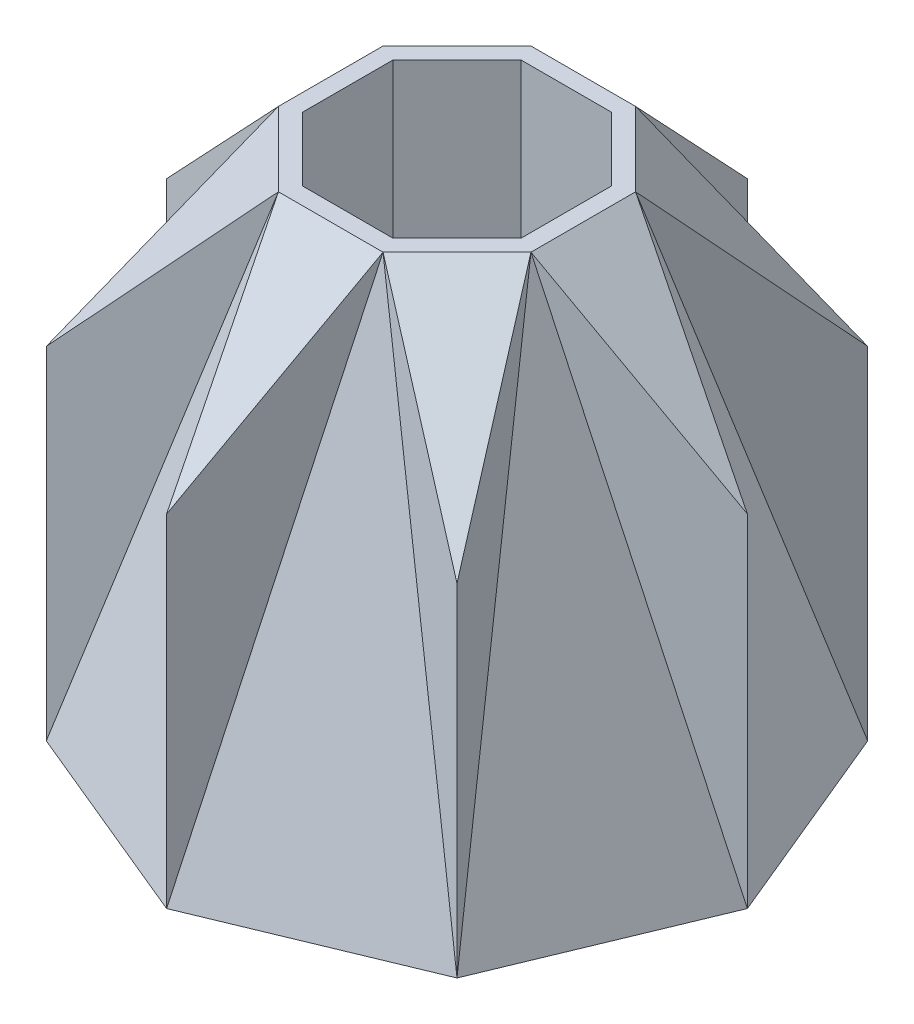
ISO-10303-21;
HEADER;
FILE_DESCRIPTION(('STEP AP214'),'2;1');
FILE_NAME('part.step','',(''),(''),'','','');
FILE_SCHEMA(('AUTOMOTIVE_DESIGN { 1 0 10303 214 1 1 1 1 }'));
ENDSEC;
DATA;
#1=APPLICATION_CONTEXT('core data for automotive mechanical design processes');
#2=APPLICATION_PROTOCOL_DEFINITION('international standard','automotive_design',2000,#1);
#3=PRODUCT_CONTEXT('',#1,'mechanical');
#4=PRODUCT('Part','Part','',(#3));
#5=PRODUCT_RELATED_PRODUCT_CATEGORY('part','',(#4));
#6=PRODUCT_DEFINITION_FORMATION('','',#4);
#7=PRODUCT_DEFINITION_CONTEXT('part definition',#1,'design');
#8=PRODUCT_DEFINITION('design','',#6,#7);
#9=PRODUCT_DEFINITION_SHAPE('','',#8);
#10=(LENGTH_UNIT() NAMED_UNIT(*) SI_UNIT(.MILLI.,.METRE.));
#11=(NAMED_UNIT(*) PLANE_ANGLE_UNIT() SI_UNIT($,.RADIAN.));
#12=(NAMED_UNIT(*) SI_UNIT($,.STERADIAN.) SOLID_ANGLE_UNIT());
#13=UNCERTAINTY_MEASURE_WITH_UNIT(LENGTH_MEASURE(1.E-05),#10,'distance_accuracy_value','');
#14=(GEOMETRIC_REPRESENTATION_CONTEXT(3) GLOBAL_UNCERTAINTY_ASSIGNED_CONTEXT((#13)) GLOBAL_UNIT_ASSIGNED_CONTEXT((#10,
#11,#12)) REPRESENTATION_CONTEXT('',''));
#15=CARTESIAN_POINT('',(0.,0.,0.));
#16=DIRECTION('',(0.,0.,1.));
#17=DIRECTION('',(1.,0.,0.));
#18=AXIS2_PLACEMENT_3D('',#15,#16,#17);
#19=CARTESIAN_POINT('',(15.3073372946032,150.,-36.9551813004516));
#20=DIRECTION('',(-0.952809107235925,0.,0.303570099265852));
#21=DIRECTION('',(0.303570099265852,0.,0.952809107235925));
#22=AXIS2_PLACEMENT_3D('',#19,#20,#21);
#23=PLANE('',#22);
#24=DIRECTION('',(-0.215561683289295,-0.704112280080444,-0.676578936811813));
#25=VECTOR('',#24,1.);
#26=CARTESIAN_POINT('',(3.94972780755112,112.901420186727,-72.6030721232406));
#27=LINE('',#26,#25);
#28=CARTESIAN_POINT('',(15.3073372946032,150.,-36.9551813004516));
#29=VERTEX_POINT('',#28);
#30=CARTESIAN_POINT('',(-1.85204174983817E-12,100.,-85.0000000000001));
#31=VERTEX_POINT('',#30);
#32=EDGE_CURVE('E57',#29,#31,#27,.T.);
#33=ORIENTED_EDGE('',*,*,#32,.F.);
#34=DIRECTION('',(0.0967296858409555,0.947875688429289,0.303603437335304));
#35=VECTOR('',#34,1.);
#36=CARTESIAN_POINT('',(2.49623453466057,24.461156959765,-77.1651209912468));
#37=LINE('',#36,#35);
#38=CARTESIAN_POINT('',(-1.85204174983817E-12,0.,-85.0000000000001));
#39=VERTEX_POINT('',#38);
#40=EDGE_CURVE('E339',#39,#29,#37,.T.);
#41=ORIENTED_EDGE('',*,*,#40,.F.);
#42=DIRECTION('',(0.,-1.,0.));
#43=VECTOR('',#42,1.);
#44=CARTESIAN_POINT('',(-1.85204174983817E-12,150.,-85.0000000000001));
#45=LINE('',#44,#43);
#46=EDGE_CURVE('E336',#31,#39,#45,.T.);
#47=ORIENTED_EDGE('',*,*,#46,.F.);
#48=EDGE_LOOP('',(#33,#41,#47));
#49=FACE_BOUND('',#48,.T.);
#50=ADVANCED_FACE('F41',(#49),#23,.F.);
#51=CARTESIAN_POINT('',(-1.85204174983817E-12,150.,-85.0000000000001));
#52=DIRECTION('',(0.952809107235942,0.,0.303570099265799));
#53=DIRECTION('',(0.303570099265799,0.,-0.952809107235942));
#54=AXIS2_PLACEMENT_3D('',#51,#52,#53);
#55=PLANE('',#54);
#56=DIRECTION('',(0.215561683289256,-0.704112280080448,-0.676578936811822));
#57=VECTOR('',#56,1.);
#58=CARTESIAN_POINT('',(-3.94972780755358,112.901420186725,-72.6030721232422));
#59=LINE('',#58,#57);
#60=CARTESIAN_POINT('',(-15.3073372946036,150.,-36.9551813004515));
#61=VERTEX_POINT('',#60);
#62=EDGE_CURVE('E282',#61,#31,#59,.T.);
#63=ORIENTED_EDGE('',*,*,#62,.T.);
#64=ORIENTED_EDGE('',*,*,#46,.T.);
#65=DIRECTION('',(0.096729685840935,-0.947875688429293,-0.303603437335299));
#66=VECTOR('',#65,1.);
#67=CARTESIAN_POINT('',(-2.49623453466407,24.4611569597638,-77.1651209912459));
#68=LINE('',#67,#66);
#69=EDGE_CURVE('E11',#61,#39,#68,.T.);
#70=ORIENTED_EDGE('',*,*,#69,.F.);
#71=EDGE_LOOP('',(#63,#64,#70));
#72=FACE_BOUND('',#71,.T.);
#73=ADVANCED_FACE('F499',(#72),#55,.F.);
#74=CARTESIAN_POINT('',(36.9551813004515,150.,15.3073372946036));
#75=DIRECTION('',(-0.303570099265842,0.,-0.952809107235928));
#76=DIRECTION('',(-0.952809107235928,0.,0.303570099265842));
#77=AXIS2_PLACEMENT_3D('',#74,#75,#76);
#78=PLANE('',#77);
#79=DIRECTION('',(0.676578936811816,-0.704112280080444,-0.215561683289288));
#80=VECTOR('',#79,1.);
#81=CARTESIAN_POINT('',(72.6030721232407,112.901420186726,3.94972780755187));
#82=LINE('',#81,#80);
#83=CARTESIAN_POINT('',(36.9551813004515,150.,15.3073372946036));
#84=VERTEX_POINT('',#83);
#85=CARTESIAN_POINT('',(85.0000000000001,100.,-9.61714008433168E-13));
#86=VERTEX_POINT('',#85);
#87=EDGE_CURVE('E65',#84,#86,#82,.T.);
#88=ORIENTED_EDGE('',*,*,#87,.F.);
#89=DIRECTION('',(-0.303603437335302,0.94787568842929,0.0967296858409512));
#90=VECTOR('',#89,1.);
#91=CARTESIAN_POINT('',(77.1651209912464,24.4611569597646,2.49623453466149));
#92=LINE('',#91,#90);
#93=CARTESIAN_POINT('',(85.0000000000001,0.,-9.61714008433168E-13));
#94=VERTEX_POINT('',#93);
#95=EDGE_CURVE('E353',#94,#84,#92,.T.);
#96=ORIENTED_EDGE('',*,*,#95,.F.);
#97=DIRECTION('',(0.,-1.,0.));
#98=VECTOR('',#97,1.);
#99=CARTESIAN_POINT('',(85.0000000000001,150.,-9.61714008433168E-13));
#100=LINE('',#99,#98);
#101=EDGE_CURVE('E350',#86,#94,#100,.T.);
#102=ORIENTED_EDGE('',*,*,#101,.F.);
#103=EDGE_LOOP('',(#88,#96,#102));
#104=FACE_BOUND('',#103,.T.);
#105=ADVANCED_FACE('F529',(#104),#78,.F.);
#106=CARTESIAN_POINT('',(85.0000000000001,150.,-9.61714008433168E-13));
#107=DIRECTION('',(-0.303570099265809,0.,0.952809107235939));
#108=DIRECTION('',(0.952809107235939,0.,0.303570099265809));
#109=AXIS2_PLACEMENT_3D('',#106,#107,#108);
#110=PLANE('',#109);
#111=DIRECTION('',(0.676578936811819,-0.704112280080448,0.215561683289264));
#112=VECTOR('',#111,1.);
#113=CARTESIAN_POINT('',(72.6030721232423,112.901420186725,-3.94972780755279));
#114=LINE('',#113,#112);
#115=CARTESIAN_POINT('',(36.9551813004514,150.,-15.3073372946042));
#116=VERTEX_POINT('',#115);
#117=EDGE_CURVE('E287',#116,#86,#114,.T.);
#118=ORIENTED_EDGE('',*,*,#117,.T.);
#119=ORIENTED_EDGE('',*,*,#101,.T.);
#120=DIRECTION('',(0.3036034373353,-0.947875688429292,0.0967296858409387));
#121=VECTOR('',#120,1.);
#122=CARTESIAN_POINT('',(77.1651209912461,24.4611569597641,-2.49623453466321));
#123=LINE('',#122,#121);
#124=EDGE_CURVE('E472',#116,#94,#123,.T.);
#125=ORIENTED_EDGE('',*,*,#124,.F.);
#126=EDGE_LOOP('',(#118,#119,#125));
#127=FACE_BOUND('',#126,.T.);
#128=ADVANCED_FACE('F811',(#127),#110,.F.);
#129=CARTESIAN_POINT('',(-15.3073372946034,150.,36.9551813004515));
#130=DIRECTION('',(0.952809107235927,0.,-0.303570099265845));
#131=DIRECTION('',(-0.303570099265845,0.,-0.952809107235927));
#132=AXIS2_PLACEMENT_3D('',#129,#130,#131);
#133=PLANE('',#132);
#134=DIRECTION('',(0.215561683289291,-0.704112280080444,0.676578936811815));
#135=VECTOR('',#134,1.);
#136=CARTESIAN_POINT('',(-3.94972780755164,112.901420186726,72.6030721232407));
#137=LINE('',#136,#135);
#138=CARTESIAN_POINT('',(-15.3073372946034,150.,36.9551813004515));
#139=VERTEX_POINT('',#138);
#140=CARTESIAN_POINT('',(1.25848992223483E-12,100.,85.0000000000001));
#141=VERTEX_POINT('',#140);
#142=EDGE_CURVE('E290',#139,#141,#137,.T.);
#143=ORIENTED_EDGE('',*,*,#142,.F.);
#144=DIRECTION('',(-0.0967296858409528,0.947875688429289,-0.303603437335303));
#145=VECTOR('',#144,1.);
#146=CARTESIAN_POINT('',(-2.49623453466117,24.4611569597648,77.1651209912466));
#147=LINE('',#146,#145);
#148=CARTESIAN_POINT('',(1.25848992223483E-12,0.,85.0000000000001));
#149=VERTEX_POINT('',#148);
#150=EDGE_CURVE('E367',#149,#139,#147,.T.);
#151=ORIENTED_EDGE('',*,*,#150,.F.);
#152=DIRECTION('',(0.,-1.,0.));
#153=VECTOR('',#152,1.);
#154=CARTESIAN_POINT('',(1.25848992223483E-12,150.,85.0000000000001));
#155=LINE('',#154,#153);
#156=EDGE_CURVE('E364',#141,#149,#155,.T.);
#157=ORIENTED_EDGE('',*,*,#156,.F.);
#158=EDGE_LOOP('',(#143,#151,#157));
#159=FACE_BOUND('',#158,.T.);
#160=ADVANCED_FACE('F801',(#159),#133,.F.);
#161=CARTESIAN_POINT('',(1.25848992223483E-12,150.,85.0000000000001));
#162=DIRECTION('',(-0.95280910723594,0.,-0.303570099265806));
#163=DIRECTION('',(-0.303570099265806,0.,0.95280910723594));
#164=AXIS2_PLACEMENT_3D('',#161,#162,#163);
#165=PLANE('',#164);
#166=DIRECTION('',(-0.215561683289261,-0.704112280080448,0.67657893681182));
#167=VECTOR('',#166,1.);
#168=CARTESIAN_POINT('',(3.94972780755305,112.901420186725,72.6030721232423));
#169=LINE('',#168,#167);
#170=CARTESIAN_POINT('',(15.3073372946038,150.,36.9551813004514));
#171=VERTEX_POINT('',#170);
#172=EDGE_CURVE('E293',#171,#141,#169,.T.);
#173=ORIENTED_EDGE('',*,*,#172,.T.);
#174=ORIENTED_EDGE('',*,*,#156,.T.);
#175=DIRECTION('',(-0.0967296858409372,-0.947875688429293,0.303603437335298));
#176=VECTOR('',#175,1.);
#177=CARTESIAN_POINT('',(2.49623453466354,24.4611569597638,77.1651209912459));
#178=LINE('',#177,#176);
#179=EDGE_CURVE('E464',#171,#149,#178,.T.);
#180=ORIENTED_EDGE('',*,*,#179,.F.);
#181=EDGE_LOOP('',(#173,#174,#180));
#182=FACE_BOUND('',#181,.T.);
#183=ADVANCED_FACE('F791',(#182),#165,.F.);
#184=CARTESIAN_POINT('',(-36.9551813004514,150.,15.3073372946037));
#185=DIRECTION('',(0.888394256659176,0.,0.459081305146473));
#186=DIRECTION('',(0.459081305146473,0.,-0.888394256659176));
#187=AXIS2_PLACEMENT_3D('',#184,#185,#186);
#188=PLANE('',#187);
#189=DIRECTION('',(-0.325988426209776,-0.704112280080444,0.630838682245463));
#190=VECTOR('',#189,1.);
#191=CARTESIAN_POINT('',(-51.6568763316493,118.245363401942,43.7574207165452));
#192=LINE('',#191,#190);
#193=CARTESIAN_POINT('',(-36.9551813004514,150.,15.3073372946037));
#194=VERTEX_POINT('',#193);
#195=CARTESIAN_POINT('',(-60.1040764008558,100.,60.1040764008574));
#196=VERTEX_POINT('',#195);
#197=EDGE_CURVE('E305',#194,#196,#192,.T.);
#198=ORIENTED_EDGE('',*,*,#197,.F.);
#199=DIRECTION('',(0.146281832531155,0.94787568842929,-0.283078266131517));
#200=VECTOR('',#199,1.);
#201=CARTESIAN_POINT('',(-56.3290846908817,24.4611569597644,52.7988759570995));
#202=LINE('',#201,#200);
#203=CARTESIAN_POINT('',(-60.1040764008558,0.,60.1040764008574));
#204=VERTEX_POINT('',#203);
#205=EDGE_CURVE('E378',#204,#194,#202,.T.);
#206=ORIENTED_EDGE('',*,*,#205,.F.);
#207=DIRECTION('',(0.,-1.,0.));
#208=VECTOR('',#207,1.);
#209=CARTESIAN_POINT('',(-60.1040764008558,150.,60.1040764008574));
#210=LINE('',#209,#208);
#211=EDGE_CURVE('E371',#196,#204,#210,.T.);
#212=ORIENTED_EDGE('',*,*,#211,.F.);
#213=EDGE_LOOP('',(#198,#206,#212));
#214=FACE_BOUND('',#213,.T.);
#215=ADVANCED_FACE('F781',(#214),#188,.F.);
#216=CARTESIAN_POINT('',(-60.1040764008558,150.,60.1040764008574));
#217=DIRECTION('',(-0.459081305146507,0.,-0.888394256659159));
#218=DIRECTION('',(-0.888394256659159,0.,0.459081305146507));
#219=AXIS2_PLACEMENT_3D('',#216,#217,#218);
#220=PLANE('',#219);
#221=DIRECTION('',(-0.630838682245447,-0.704112280080448,0.325988426209798));
#222=VECTOR('',#221,1.);
#223=CARTESIAN_POINT('',(-43.7574207165462,118.24536340194,51.6568763316514));
#224=LINE('',#223,#222);
#225=EDGE_CURVE('E308',#139,#196,#224,.T.);
#226=ORIENTED_EDGE('',*,*,#225,.T.);
#227=ORIENTED_EDGE('',*,*,#211,.T.);
#228=DIRECTION('',(-0.283078266131506,-0.947875688429292,0.146281832531163));
#229=VECTOR('',#228,1.);
#230=CARTESIAN_POINT('',(-52.7988759570979,24.4611569597638,56.3290846908829));
#231=LINE('',#230,#229);
#232=EDGE_CURVE('E374',#139,#204,#231,.T.);
#233=ORIENTED_EDGE('',*,*,#232,.F.);
#234=EDGE_LOOP('',(#226,#227,#233));
#235=FACE_BOUND('',#234,.T.);
#236=ADVANCED_FACE('F771',(#235),#220,.F.);
#237=CARTESIAN_POINT('',(15.3073372946038,150.,36.9551813004514));
#238=DIRECTION('',(0.45908130514647,0.,-0.888394256659178));
#239=DIRECTION('',(-0.888394256659178,0.,-0.45908130514647));
#240=AXIS2_PLACEMENT_3D('',#237,#238,#239);
#241=PLANE('',#240);
#242=DIRECTION('',(0.630838682245464,-0.704112280080444,0.325988426209773));
#243=VECTOR('',#242,1.);
#244=CARTESIAN_POINT('',(43.7574207165454,118.245363401942,51.6568763316492));
#245=LINE('',#244,#243);
#246=CARTESIAN_POINT('',(60.1040764008576,100.,60.1040764008556));
#247=VERTEX_POINT('',#246);
#248=EDGE_CURVE('E314',#171,#247,#245,.T.);
#249=ORIENTED_EDGE('',*,*,#248,.F.);
#250=DIRECTION('',(-0.283078266131521,0.947875688429289,-0.146281832531156));
#251=VECTOR('',#250,1.);
#252=CARTESIAN_POINT('',(52.7988759571,24.4611569597648,56.3290846908817));
#253=LINE('',#252,#251);
#254=CARTESIAN_POINT('',(60.1040764008576,0.,60.1040764008556));
#255=VERTEX_POINT('',#254);
#256=EDGE_CURVE('E360',#255,#171,#253,.T.);
#257=ORIENTED_EDGE('',*,*,#256,.F.);
#258=DIRECTION('',(0.,-1.,0.));
#259=VECTOR('',#258,1.);
#260=CARTESIAN_POINT('',(60.1040764008576,150.,60.1040764008556));
#261=LINE('',#260,#259);
#262=EDGE_CURVE('E357',#247,#255,#261,.T.);
#263=ORIENTED_EDGE('',*,*,#262,.F.);
#264=EDGE_LOOP('',(#249,#257,#263));
#265=FACE_BOUND('',#264,.T.);
#266=ADVANCED_FACE('F520',(#265),#241,.F.);
#267=CARTESIAN_POINT('',(60.1040764008576,150.,60.1040764008556));
#268=DIRECTION('',(-0.888394256659157,0.,0.459081305146511));
#269=DIRECTION('',(0.459081305146511,0.,0.888394256659157));
#270=AXIS2_PLACEMENT_3D('',#267,#268,#269);
#271=PLANE('',#270);
#272=DIRECTION('',(0.3259884262098,-0.704112280080448,0.630838682245445));
#273=VECTOR('',#272,1.);
#274=CARTESIAN_POINT('',(51.6568763316516,118.24536340194,43.757420716546));
#275=LINE('',#274,#273);
#276=EDGE_CURVE('E309',#84,#247,#275,.T.);
#277=ORIENTED_EDGE('',*,*,#276,.T.);
#278=ORIENTED_EDGE('',*,*,#262,.T.);
#279=DIRECTION('',(0.146281832531164,-0.947875688429293,0.283078266131505));
#280=VECTOR('',#279,1.);
#281=CARTESIAN_POINT('',(56.3290846908831,24.4611569597638,52.7988759570976));
#282=LINE('',#281,#280);
#283=EDGE_CURVE('E468',#84,#255,#282,.T.);
#284=ORIENTED_EDGE('',*,*,#283,.F.);
#285=EDGE_LOOP('',(#277,#278,#284));
#286=FACE_BOUND('',#285,.T.);
#287=ADVANCED_FACE('F512',(#286),#271,.F.);
#288=CARTESIAN_POINT('',(36.9551813004513,150.,-15.3073372946039));
#289=DIRECTION('',(-0.88839425665918,0.,-0.459081305146467));
#290=DIRECTION('',(-0.459081305146467,0.,0.88839425665918));
#291=AXIS2_PLACEMENT_3D('',#288,#289,#290);
#292=PLANE('',#291);
#293=DIRECTION('',(0.325988426209771,-0.704112280080444,-0.630838682245465));
#294=VECTOR('',#293,1.);
#295=CARTESIAN_POINT('',(51.656876331649,118.245363401942,-43.7574207165456));
#296=LINE('',#295,#294);
#297=CARTESIAN_POINT('',(60.1040764008554,100.,-60.1040764008578));
#298=VERTEX_POINT('',#297);
#299=EDGE_CURVE('E304',#116,#298,#296,.T.);
#300=ORIENTED_EDGE('',*,*,#299,.F.);
#301=DIRECTION('',(-0.146281832531155,0.947875688429289,0.283078266131521));
#302=VECTOR('',#301,1.);
#303=CARTESIAN_POINT('',(56.3290846908815,24.4611569597648,-52.7988759571002));
#304=LINE('',#303,#302);
#305=CARTESIAN_POINT('',(60.1040764008554,0.,-60.1040764008578));
#306=VERTEX_POINT('',#305);
#307=EDGE_CURVE('E346',#306,#116,#304,.T.);
#308=ORIENTED_EDGE('',*,*,#307,.F.);
#309=DIRECTION('',(0.,-1.,0.));
#310=VECTOR('',#309,1.);
#311=CARTESIAN_POINT('',(60.1040764008554,150.,-60.1040764008578));
#312=LINE('',#311,#310);
#313=EDGE_CURVE('E343',#298,#306,#312,.T.);
#314=ORIENTED_EDGE('',*,*,#313,.F.);
#315=EDGE_LOOP('',(#300,#308,#314));
#316=FACE_BOUND('',#315,.T.);
#317=ADVANCED_FACE('F510',(#316),#292,.F.);
#318=CARTESIAN_POINT('',(60.1040764008554,150.,-60.1040764008578));
#319=DIRECTION('',(0.459081305146514,0.,0.888394256659156));
#320=DIRECTION('',(0.888394256659156,0.,-0.459081305146514));
#321=AXIS2_PLACEMENT_3D('',#318,#319,#320);
#322=PLANE('',#321);
#323=DIRECTION('',(0.630838682245444,-0.704112280080448,-0.325988426209802));
#324=VECTOR('',#323,1.);
#325=CARTESIAN_POINT('',(43.7574207165459,118.24536340194,-51.6568763316517));
#326=LINE('',#325,#324);
#327=EDGE_CURVE('E317',#29,#298,#326,.T.);
#328=ORIENTED_EDGE('',*,*,#327,.T.);
#329=ORIENTED_EDGE('',*,*,#313,.T.);
#330=DIRECTION('',(0.283078266131503,-0.947875688429293,-0.146281832531164));
#331=VECTOR('',#330,1.);
#332=CARTESIAN_POINT('',(52.7988759570973,24.4611569597636,-56.3290846908832));
#333=LINE('',#332,#331);
#334=EDGE_CURVE('E50',#29,#306,#333,.T.);
#335=ORIENTED_EDGE('',*,*,#334,.F.);
#336=EDGE_LOOP('',(#328,#329,#335));
#337=FACE_BOUND('',#336,.T.);
#338=ADVANCED_FACE('F508',(#337),#322,.F.);
#339=CARTESIAN_POINT('',(-15.3073372946041,150.,-36.9551813004513));
#340=DIRECTION('',(-0.459081305146464,0.,0.888394256659181));
#341=DIRECTION('',(0.888394256659181,0.,0.459081305146464));
#342=AXIS2_PLACEMENT_3D('',#339,#340,#341);
#343=PLANE('',#342);
#344=DIRECTION('',(-0.630838682245466,-0.704112280080444,-0.325988426209769));
#345=VECTOR('',#344,1.);
#346=CARTESIAN_POINT('',(-43.7574207165458,118.245363401942,-51.6568763316489));
#347=LINE('',#346,#345);
#348=CARTESIAN_POINT('',(-60.104076400858,100.,-60.1040764008552));
#349=VERTEX_POINT('',#348);
#350=EDGE_CURVE('E297',#61,#349,#347,.T.);
#351=ORIENTED_EDGE('',*,*,#350,.F.);
#352=DIRECTION('',(0.283078266131521,0.947875688429289,0.146281832531154));
#353=VECTOR('',#352,1.);
#354=CARTESIAN_POINT('',(-52.7988759571004,24.4611569597648,-56.3290846908814));
#355=LINE('',#354,#353);
#356=CARTESIAN_POINT('',(-60.104076400858,0.,-60.1040764008552));
#357=VERTEX_POINT('',#356);
#358=EDGE_CURVE('E328',#357,#61,#355,.T.);
#359=ORIENTED_EDGE('',*,*,#358,.F.);
#360=DIRECTION('',(0.,-1.,0.));
#361=VECTOR('',#360,1.);
#362=CARTESIAN_POINT('',(-60.104076400858,150.,-60.1040764008552));
#363=LINE('',#362,#361);
#364=EDGE_CURVE('E313',#349,#357,#363,.T.);
#365=ORIENTED_EDGE('',*,*,#364,.F.);
#366=EDGE_LOOP('',(#351,#359,#365));
#367=FACE_BOUND('',#366,.T.);
#368=ADVANCED_FACE('F518',(#367),#343,.F.);
#369=CARTESIAN_POINT('',(-60.104076400858,150.,-60.1040764008552));
#370=DIRECTION('',(0.888394256659154,0.,-0.459081305146517));
#371=DIRECTION('',(-0.459081305146517,0.,-0.888394256659154));
#372=AXIS2_PLACEMENT_3D('',#369,#370,#371);
#373=PLANE('',#372);
#374=DIRECTION('',(-0.325988426209805,-0.704112280080448,-0.630838682245443));
#375=VECTOR('',#374,1.);
#376=CARTESIAN_POINT('',(-51.6568763316519,118.24536340194,-43.7574207165457));
#377=LINE('',#376,#375);
#378=CARTESIAN_POINT('',(-36.9551813004517,150.,-15.3073372946031));
#379=VERTEX_POINT('',#378);
#380=EDGE_CURVE('E300',#379,#349,#377,.T.);
#381=ORIENTED_EDGE('',*,*,#380,.T.);
#382=ORIENTED_EDGE('',*,*,#364,.T.);
#383=DIRECTION('',(-0.146281832531166,-0.947875688429292,-0.283078266131504));
#384=VECTOR('',#383,1.);
#385=CARTESIAN_POINT('',(-56.3290846908835,24.4611569597638,-52.7988759570973));
#386=LINE('',#385,#384);
#387=EDGE_CURVE('E332',#379,#357,#386,.T.);
#388=ORIENTED_EDGE('',*,*,#387,.F.);
#389=EDGE_LOOP('',(#381,#382,#388));
#390=FACE_BOUND('',#389,.T.);
#391=ADVANCED_FACE('F531',(#390),#373,.F.);
#392=CARTESIAN_POINT('',(-28.1919432733391,18.923017892702,-68.0613718001466));
#393=DIRECTION('',(-0.37065102111365,0.248788664068957,-0.894830722079988));
#394=DIRECTION('',(-0.923879532511283,0.,0.382683432365098));
#395=AXIS2_PLACEMENT_3D('',#392,#393,#394);
#396=PLANE('',#395);
#397=DIRECTION('',(-0.923879532511287,0.,0.38268343236509));
#398=VECTOR('',#397,1.);
#399=CARTESIAN_POINT('',(-30.0520382004282,0.,-72.5520382004283));
#400=LINE('',#399,#398);
#401=EDGE_CURVE('E446',#39,#357,#400,.T.);
#402=ORIENTED_EDGE('',*,*,#401,.T.);
#403=ORIENTED_EDGE('',*,*,#358,.T.);
#404=ORIENTED_EDGE('',*,*,#69,.T.);
#405=EDGE_LOOP('',(#402,#403,#404));
#406=FACE_BOUND('',#405,.T.);
#407=ADVANCED_FACE('F495',(#406),#396,.T.);
#408=CARTESIAN_POINT('',(-68.0613718001472,18.923017892702,-28.1919432733378));
#409=DIRECTION('',(-0.894830722079995,0.248788664068957,-0.370651021113633));
#410=DIRECTION('',(-0.38268343236508,0.,0.923879532511291));
#411=AXIS2_PLACEMENT_3D('',#408,#409,#410);
#412=PLANE('',#411);
#413=DIRECTION('',(0.303603437335301,0.94787568842929,-0.0967296858409507));
#414=VECTOR('',#413,1.);
#415=CARTESIAN_POINT('',(-77.1651209912462,24.4611569597644,-2.49623453466154));
#416=LINE('',#415,#414);
#417=CARTESIAN_POINT('',(-85.0000000000001,0.,9.61714008433168E-13));
#418=VERTEX_POINT('',#417);
#419=EDGE_CURVE('E460',#418,#379,#416,.T.);
#420=ORIENTED_EDGE('',*,*,#419,.T.);
#421=ORIENTED_EDGE('',*,*,#387,.T.);
#422=DIRECTION('',(-0.38268343236509,0.,0.923879532511287));
#423=VECTOR('',#422,1.);
#424=CARTESIAN_POINT('',(-72.5520382004283,0.,-30.0520382004283));
#425=LINE('',#424,#423);
#426=EDGE_CURVE('E450',#357,#418,#425,.T.);
#427=ORIENTED_EDGE('',*,*,#426,.T.);
#428=EDGE_LOOP('',(#420,#421,#427));
#429=FACE_BOUND('',#428,.T.);
#430=ADVANCED_FACE('F725',(#429),#412,.T.);
#431=CARTESIAN_POINT('',(28.1919432733386,18.923017892702,-68.0613718001469));
#432=DIRECTION('',(0.370651021113642,0.248788664068957,-0.894830722079991));
#433=DIRECTION('',(-0.923879532511287,0.,-0.38268343236509));
#434=AXIS2_PLACEMENT_3D('',#431,#432,#433);
#435=PLANE('',#434);
#436=DIRECTION('',(-0.923879532511287,0.,-0.38268343236509));
#437=VECTOR('',#436,1.);
#438=CARTESIAN_POINT('',(30.0520382004283,0.,-72.5520382004283));
#439=LINE('',#438,#437);
#440=EDGE_CURVE('E442',#306,#39,#439,.T.);
#441=ORIENTED_EDGE('',*,*,#440,.T.);
#442=ORIENTED_EDGE('',*,*,#40,.T.);
#443=ORIENTED_EDGE('',*,*,#334,.T.);
#444=EDGE_LOOP('',(#441,#442,#443));
#445=FACE_BOUND('',#444,.T.);
#446=ADVANCED_FACE('F479',(#445),#435,.T.);
#447=CARTESIAN_POINT('',(68.0613718001467,18.923017892702,-28.1919432733389));
#448=DIRECTION('',(0.894830722079989,0.248788664068957,-0.370651021113647));
#449=DIRECTION('',(-0.382683432365095,0.,-0.923879532511285));
#450=AXIS2_PLACEMENT_3D('',#447,#448,#449);
#451=PLANE('',#450);
#452=DIRECTION('',(-0.382683432365089,0.,-0.923879532511287));
#453=VECTOR('',#452,1.);
#454=CARTESIAN_POINT('',(72.5520382004283,0.,-30.0520382004282));
#455=LINE('',#454,#453);
#456=EDGE_CURVE('E438',#94,#306,#455,.T.);
#457=ORIENTED_EDGE('',*,*,#456,.T.);
#458=ORIENTED_EDGE('',*,*,#307,.T.);
#459=ORIENTED_EDGE('',*,*,#124,.T.);
#460=EDGE_LOOP('',(#457,#458,#459));
#461=FACE_BOUND('',#460,.T.);
#462=ADVANCED_FACE('F486',(#461),#451,.T.);
#463=CARTESIAN_POINT('',(68.061371800147,18.923017892702,28.1919432733383));
#464=DIRECTION('',(0.894830722079992,0.248788664068957,0.370651021113639));
#465=DIRECTION('',(0.382683432365087,0.,-0.923879532511288));
#466=AXIS2_PLACEMENT_3D('',#463,#464,#465);
#467=PLANE('',#466);
#468=DIRECTION('',(0.38268343236509,0.,-0.923879532511287));
#469=VECTOR('',#468,1.);
#470=CARTESIAN_POINT('',(72.5520382004283,0.,30.0520382004283));
#471=LINE('',#470,#469);
#472=EDGE_CURVE('E434',#255,#94,#471,.T.);
#473=ORIENTED_EDGE('',*,*,#472,.T.);
#474=ORIENTED_EDGE('',*,*,#95,.T.);
#475=ORIENTED_EDGE('',*,*,#283,.T.);
#476=EDGE_LOOP('',(#473,#474,#475));
#477=FACE_BOUND('',#476,.T.);
#478=ADVANCED_FACE('F704',(#477),#467,.T.);
#479=CARTESIAN_POINT('',(28.1919432733387,18.923017892702,68.0613718001468));
#480=DIRECTION('',(0.370651021113644,0.248788664068957,0.894830722079991));
#481=DIRECTION('',(0.923879532511286,0.,-0.382683432365091));
#482=AXIS2_PLACEMENT_3D('',#479,#480,#481);
#483=PLANE('',#482);
#484=DIRECTION('',(0.923879532511287,0.,-0.382683432365089));
#485=VECTOR('',#484,1.);
#486=CARTESIAN_POINT('',(30.0520382004282,0.,72.5520382004283));
#487=LINE('',#486,#485);
#488=EDGE_CURVE('E430',#149,#255,#487,.T.);
#489=ORIENTED_EDGE('',*,*,#488,.T.);
#490=ORIENTED_EDGE('',*,*,#256,.T.);
#491=ORIENTED_EDGE('',*,*,#179,.T.);
#492=EDGE_LOOP('',(#489,#490,#491));
#493=FACE_BOUND('',#492,.T.);
#494=ADVANCED_FACE('F697',(#493),#483,.T.);
#495=CARTESIAN_POINT('',(-28.1919432733386,18.923017892702,68.0613718001469));
#496=DIRECTION('',(-0.370651021113642,0.248788664068957,0.894830722079991));
#497=DIRECTION('',(0.923879532511287,0.,0.38268343236509));
#498=AXIS2_PLACEMENT_3D('',#495,#496,#497);
#499=PLANE('',#498);
#500=DIRECTION('',(0.923879532511287,0.,0.38268343236509));
#501=VECTOR('',#500,1.);
#502=CARTESIAN_POINT('',(-30.0520382004283,0.,72.5520382004283));
#503=LINE('',#502,#501);
#504=EDGE_CURVE('E392',#204,#149,#503,.T.);
#505=ORIENTED_EDGE('',*,*,#504,.T.);
#506=ORIENTED_EDGE('',*,*,#150,.T.);
#507=ORIENTED_EDGE('',*,*,#232,.T.);
#508=EDGE_LOOP('',(#505,#506,#507));
#509=FACE_BOUND('',#508,.T.);
#510=ADVANCED_FACE('F689',(#509),#499,.T.);
#511=CARTESIAN_POINT('',(-68.0613718001465,18.923017892702,28.1919432733394));
#512=DIRECTION('',(-0.894830722079987,0.248788664068957,0.370651021113653));
#513=DIRECTION('',(0.382683432365101,0.,0.923879532511282));
#514=AXIS2_PLACEMENT_3D('',#511,#512,#513);
#515=PLANE('',#514);
#516=DIRECTION('',(0.382683432365089,0.,0.923879532511287));
#517=VECTOR('',#516,1.);
#518=CARTESIAN_POINT('',(-72.5520382004283,0.,30.0520382004282));
#519=LINE('',#518,#517);
#520=EDGE_CURVE('E398',#418,#204,#519,.T.);
#521=ORIENTED_EDGE('',*,*,#520,.T.);
#522=ORIENTED_EDGE('',*,*,#205,.T.);
#523=DIRECTION('',(-0.303603437335301,-0.947875688429291,-0.0967296858409393));
#524=VECTOR('',#523,1.);
#525=CARTESIAN_POINT('',(-77.1651209912463,24.4611569597643,2.49623453466316));
#526=LINE('',#525,#524);
#527=EDGE_CURVE('E426',#194,#418,#526,.T.);
#528=ORIENTED_EDGE('',*,*,#527,.T.);
#529=EDGE_LOOP('',(#521,#522,#528));
#530=FACE_BOUND('',#529,.T.);
#531=ADVANCED_FACE('F681',(#530),#515,.T.);
#532=CARTESIAN_POINT('',(-36.9551813004515,150.,-15.3073372946036));
#533=DIRECTION('',(0.303570099265842,0.,0.952809107235928));
#534=DIRECTION('',(0.952809107235928,0.,-0.303570099265842));
#535=AXIS2_PLACEMENT_3D('',#532,#533,#534);
#536=PLANE('',#535);
#537=DIRECTION('',(-0.676578936811815,-0.704112280080444,0.215561683289288));
#538=VECTOR('',#537,1.);
#539=CARTESIAN_POINT('',(-72.6030721232407,112.901420186726,-3.94972780755187));
#540=LINE('',#539,#538);
#541=CARTESIAN_POINT('',(-85.0000000000001,100.,9.61714008433168E-13));
#542=VERTEX_POINT('',#541);
#543=EDGE_CURVE('E382',#379,#542,#540,.T.);
#544=ORIENTED_EDGE('',*,*,#543,.F.);
#545=ORIENTED_EDGE('',*,*,#419,.F.);
#546=DIRECTION('',(0.,-1.,0.));
#547=VECTOR('',#546,1.);
#548=CARTESIAN_POINT('',(-85.0000000000001,150.,9.61714008433168E-13));
#549=LINE('',#548,#547);
#550=EDGE_CURVE('E389',#542,#418,#549,.T.);
#551=ORIENTED_EDGE('',*,*,#550,.F.);
#552=EDGE_LOOP('',(#544,#545,#551));
#553=FACE_BOUND('',#552,.T.);
#554=ADVANCED_FACE('F673',(#553),#536,.F.);
#555=CARTESIAN_POINT('',(-85.0000000000001,150.,9.61714008433168E-13));
#556=DIRECTION('',(0.303570099265809,0.,-0.952809107235939));
#557=DIRECTION('',(-0.952809107235939,0.,-0.303570099265809));
#558=AXIS2_PLACEMENT_3D('',#555,#556,#557);
#559=PLANE('',#558);
#560=DIRECTION('',(-0.676578936811819,-0.704112280080448,-0.215561683289264));
#561=VECTOR('',#560,1.);
#562=CARTESIAN_POINT('',(-72.6030721232424,112.901420186725,3.94972780755277));
#563=LINE('',#562,#561);
#564=EDGE_CURVE('E385',#194,#542,#563,.T.);
#565=ORIENTED_EDGE('',*,*,#564,.T.);
#566=ORIENTED_EDGE('',*,*,#550,.T.);
#567=ORIENTED_EDGE('',*,*,#527,.F.);
#568=EDGE_LOOP('',(#565,#566,#567));
#569=FACE_BOUND('',#568,.T.);
#570=ADVANCED_FACE('F667',(#569),#559,.F.);
#571=CARTESIAN_POINT('',(0.,0.,0.));
#572=DIRECTION('',(0.,1.,0.));
#573=DIRECTION('',(0.,0.,1.));
#574=AXIS2_PLACEMENT_3D('',#571,#572,#573);
#575=PLANE('',#574);
#576=ORIENTED_EDGE('',*,*,#426,.F.);
#577=ORIENTED_EDGE('',*,*,#401,.F.);
#578=ORIENTED_EDGE('',*,*,#440,.F.);
#579=ORIENTED_EDGE('',*,*,#456,.F.);
#580=ORIENTED_EDGE('',*,*,#472,.F.);
#581=ORIENTED_EDGE('',*,*,#488,.F.);
#582=ORIENTED_EDGE('',*,*,#504,.F.);
#583=ORIENTED_EDGE('',*,*,#520,.F.);
#584=EDGE_LOOP('',(#576,#577,#578,#579,#580,#581,#582,#583));
#585=FACE_BOUND('',#584,.T.);
#586=DIRECTION('',(-1.,0.,0.));
#587=VECTOR('',#586,1.);
#588=CARTESIAN_POINT('',(0.,0.,-31.9551813004515));
#589=LINE('',#588,#587);
#590=CARTESIAN_POINT('',(13.2362694827381,0.,-31.9551813004515));
#591=VERTEX_POINT('',#590);
#592=CARTESIAN_POINT('',(-13.2362694827381,0.,-31.9551813004515));
#593=VERTEX_POINT('',#592);
#594=EDGE_CURVE('E186',#591,#593,#589,.T.);
#595=ORIENTED_EDGE('',*,*,#594,.T.);
#596=DIRECTION('',(-0.707106781186547,0.,0.707106781186548));
#597=VECTOR('',#596,1.);
#598=CARTESIAN_POINT('',(-22.5957253915948,0.,-22.5957253915948));
#599=LINE('',#598,#597);
#600=CARTESIAN_POINT('',(-31.9551813004514,0.,-13.2362694827381));
#601=VERTEX_POINT('',#600);
#602=EDGE_CURVE('E205',#593,#601,#599,.T.);
#603=ORIENTED_EDGE('',*,*,#602,.T.);
#604=DIRECTION('',(0.,0.,1.));
#605=VECTOR('',#604,1.);
#606=CARTESIAN_POINT('',(-31.9551813004514,0.,0.));
#607=LINE('',#606,#605);
#608=CARTESIAN_POINT('',(-31.9551813004514,0.,13.2362694827381));
#609=VERTEX_POINT('',#608);
#610=EDGE_CURVE('E254',#601,#609,#607,.T.);
#611=ORIENTED_EDGE('',*,*,#610,.T.);
#612=DIRECTION('',(0.707106781186548,0.,0.707106781186548));
#613=VECTOR('',#612,1.);
#614=CARTESIAN_POINT('',(-22.5957253915948,0.,22.5957253915948));
#615=LINE('',#614,#613);
#616=CARTESIAN_POINT('',(-13.2362694827381,0.,31.9551813004515));
#617=VERTEX_POINT('',#616);
#618=EDGE_CURVE('E250',#609,#617,#615,.T.);
#619=ORIENTED_EDGE('',*,*,#618,.T.);
#620=DIRECTION('',(1.,0.,0.));
#621=VECTOR('',#620,1.);
#622=CARTESIAN_POINT('',(0.,0.,31.9551813004515));
#623=LINE('',#622,#621);
#624=CARTESIAN_POINT('',(13.2362694827381,0.,31.9551813004515));
#625=VERTEX_POINT('',#624);
#626=EDGE_CURVE('E246',#617,#625,#623,.T.);
#627=ORIENTED_EDGE('',*,*,#626,.T.);
#628=DIRECTION('',(0.707106781186548,0.,-0.707106781186548));
#629=VECTOR('',#628,1.);
#630=CARTESIAN_POINT('',(22.5957253915948,0.,22.5957253915948));
#631=LINE('',#630,#629);
#632=CARTESIAN_POINT('',(31.9551813004515,0.,13.2362694827381));
#633=VERTEX_POINT('',#632);
#634=EDGE_CURVE('E242',#625,#633,#631,.T.);
#635=ORIENTED_EDGE('',*,*,#634,.T.);
#636=DIRECTION('',(0.,0.,-1.));
#637=VECTOR('',#636,1.);
#638=CARTESIAN_POINT('',(31.9551813004515,0.,0.));
#639=LINE('',#638,#637);
#640=CARTESIAN_POINT('',(31.9551813004515,0.,-13.2362694827381));
#641=VERTEX_POINT('',#640);
#642=EDGE_CURVE('E238',#633,#641,#639,.T.);
#643=ORIENTED_EDGE('',*,*,#642,.T.);
#644=DIRECTION('',(-0.707106781186548,0.,-0.707106781186548));
#645=VECTOR('',#644,1.);
#646=CARTESIAN_POINT('',(22.5957253915948,0.,-22.5957253915948));
#647=LINE('',#646,#645);
#648=EDGE_CURVE('E235',#641,#591,#647,.T.);
#649=ORIENTED_EDGE('',*,*,#648,.T.);
#650=EDGE_LOOP('',(#595,#603,#611,#619,#627,#635,#643,#649));
#651=FACE_BOUND('',#650,.T.);
#652=ADVANCED_FACE('F43',(#585,#651),#575,.F.);
#653=CARTESIAN_POINT('',(-85.0000000000001,100.,85.0010000000001));
#654=DIRECTION('',(-0.721064340040787,0.692868109759386,0.));
#655=DIRECTION('',(-0.692868109759386,-0.721064340040787,0.));
#656=AXIS2_PLACEMENT_3D('',#653,#654,#655);
#657=PLANE('',#656);
#658=DIRECTION('',(0.,0.,1.));
#659=VECTOR('',#658,1.);
#660=CARTESIAN_POINT('',(-36.9551813004514,150.,0.));
#661=LINE('',#660,#659);
#662=EDGE_CURVE('E402',#379,#194,#661,.T.);
#663=ORIENTED_EDGE('',*,*,#662,.F.);
#664=ORIENTED_EDGE('',*,*,#543,.T.);
#665=ORIENTED_EDGE('',*,*,#564,.F.);
#666=EDGE_LOOP('',(#663,#664,#665));
#667=FACE_BOUND('',#666,.T.);
#668=ADVANCED_FACE('F552',(#667),#657,.T.);
#669=CARTESIAN_POINT('',(-145.105076400856,100.,24.8969235991452));
#670=DIRECTION('',(-0.509869484514649,0.692868109759386,-0.509869484514637));
#671=DIRECTION('',(-0.805424799421288,-0.592697977453253,0.));
#672=AXIS2_PLACEMENT_3D('',#669,#670,#671);
#673=PLANE('',#672);
#674=DIRECTION('',(-0.707106781186547,0.,0.707106781186548));
#675=VECTOR('',#674,1.);
#676=CARTESIAN_POINT('',(-26.1312592975275,150.,-26.1312592975275));
#677=LINE('',#676,#675);
#678=EDGE_CURVE('E406',#61,#379,#677,.T.);
#679=ORIENTED_EDGE('',*,*,#678,.F.);
#680=ORIENTED_EDGE('',*,*,#350,.T.);
#681=ORIENTED_EDGE('',*,*,#380,.F.);
#682=EDGE_LOOP('',(#679,#680,#681));
#683=FACE_BOUND('',#682,.T.);
#684=ADVANCED_FACE('F541',(#683),#673,.T.);
#685=CARTESIAN_POINT('',(-24.8969235991448,100.,-145.105076400857));
#686=DIRECTION('',(0.509869484514638,0.692868109759386,-0.509869484514647));
#687=DIRECTION('',(0.,0.592697977453252,0.805424799421289));
#688=AXIS2_PLACEMENT_3D('',#685,#686,#687);
#689=PLANE('',#688);
#690=DIRECTION('',(-0.707106781186548,0.,-0.707106781186548));
#691=VECTOR('',#690,1.);
#692=CARTESIAN_POINT('',(26.1312592975275,150.,-26.1312592975275));
#693=LINE('',#692,#691);
#694=EDGE_CURVE('E414',#116,#29,#693,.T.);
#695=ORIENTED_EDGE('',*,*,#694,.F.);
#696=ORIENTED_EDGE('',*,*,#299,.T.);
#697=ORIENTED_EDGE('',*,*,#327,.F.);
#698=EDGE_LOOP('',(#695,#696,#697));
#699=FACE_BOUND('',#698,.T.);
#700=ADVANCED_FACE('F505',(#699),#689,.T.);
#701=CARTESIAN_POINT('',(145.105076400857,100.,-24.8969235991443));
#702=DIRECTION('',(0.509869484514646,0.692868109759386,0.50986948451464));
#703=DIRECTION('',(-0.80542479942129,0.592697977453251,0.));
#704=AXIS2_PLACEMENT_3D('',#701,#702,#703);
#705=PLANE('',#704);
#706=DIRECTION('',(0.707106781186547,0.,-0.707106781186548));
#707=VECTOR('',#706,1.);
#708=CARTESIAN_POINT('',(26.1312592975275,150.,26.1312592975275));
#709=LINE('',#708,#707);
#710=EDGE_CURVE('E422',#171,#84,#709,.T.);
#711=ORIENTED_EDGE('',*,*,#710,.F.);
#712=ORIENTED_EDGE('',*,*,#248,.T.);
#713=ORIENTED_EDGE('',*,*,#276,.F.);
#714=EDGE_LOOP('',(#711,#712,#713));
#715=FACE_BOUND('',#714,.T.);
#716=ADVANCED_FACE('F540',(#715),#705,.T.);
#717=CARTESIAN_POINT('',(24.8969235991438,100.,145.105076400857));
#718=DIRECTION('',(-0.509869484514642,0.692868109759386,0.509869484514644));
#719=DIRECTION('',(0.,-0.592697977453249,0.805424799421291));
#720=AXIS2_PLACEMENT_3D('',#717,#718,#719);
#721=PLANE('',#720);
#722=DIRECTION('',(0.707106781186548,0.,0.707106781186548));
#723=VECTOR('',#722,1.);
#724=CARTESIAN_POINT('',(-26.1312592975275,150.,26.1312592975275));
#725=LINE('',#724,#723);
#726=EDGE_CURVE('E397',#194,#139,#725,.T.);
#727=ORIENTED_EDGE('',*,*,#726,.F.);
#728=ORIENTED_EDGE('',*,*,#197,.T.);
#729=ORIENTED_EDGE('',*,*,#225,.F.);
#730=EDGE_LOOP('',(#727,#728,#729));
#731=FACE_BOUND('',#730,.T.);
#732=ADVANCED_FACE('F544',(#731),#721,.T.);
#733=CARTESIAN_POINT('',(85.0010000000007,100.,84.9999999999998));
#734=DIRECTION('',(0.,0.692868109759386,0.721064340040787));
#735=DIRECTION('',(0.,-0.721064340040787,0.692868109759386));
#736=AXIS2_PLACEMENT_3D('',#733,#734,#735);
#737=PLANE('',#736);
#738=DIRECTION('',(1.,0.,0.));
#739=VECTOR('',#738,1.);
#740=CARTESIAN_POINT('',(0.,150.,36.9551813004515));
#741=LINE('',#740,#739);
#742=EDGE_CURVE('E393',#139,#171,#741,.T.);
#743=ORIENTED_EDGE('',*,*,#742,.F.);
#744=ORIENTED_EDGE('',*,*,#142,.T.);
#745=ORIENTED_EDGE('',*,*,#172,.F.);
#746=EDGE_LOOP('',(#743,#744,#745));
#747=FACE_BOUND('',#746,.T.);
#748=ADVANCED_FACE('F548',(#747),#737,.T.);
#749=CARTESIAN_POINT('',(85.0000000000001,100.,-85.0010000000002));
#750=DIRECTION('',(0.721064340040787,0.692868109759386,0.));
#751=DIRECTION('',(-0.692868109759386,0.721064340040787,0.));
#752=AXIS2_PLACEMENT_3D('',#749,#750,#751);
#753=PLANE('',#752);
#754=DIRECTION('',(0.,0.,-1.));
#755=VECTOR('',#754,1.);
#756=CARTESIAN_POINT('',(36.9551813004515,150.,0.));
#757=LINE('',#756,#755);
#758=EDGE_CURVE('E418',#84,#116,#757,.T.);
#759=ORIENTED_EDGE('',*,*,#758,.F.);
#760=ORIENTED_EDGE('',*,*,#87,.T.);
#761=ORIENTED_EDGE('',*,*,#117,.F.);
#762=EDGE_LOOP('',(#759,#760,#761));
#763=FACE_BOUND('',#762,.T.);
#764=ADVANCED_FACE('F556',(#763),#753,.T.);
#765=CARTESIAN_POINT('',(-85.0010000000019,100.,-84.9999999999992));
#766=DIRECTION('',(0.,0.692868109759386,-0.721064340040787));
#767=DIRECTION('',(0.,0.721064340040787,0.692868109759386));
#768=AXIS2_PLACEMENT_3D('',#765,#766,#767);
#769=PLANE('',#768);
#770=DIRECTION('',(-1.,0.,0.));
#771=VECTOR('',#770,1.);
#772=CARTESIAN_POINT('',(0.,150.,-36.9551813004515));
#773=LINE('',#772,#771);
#774=EDGE_CURVE('E410',#29,#61,#773,.T.);
#775=ORIENTED_EDGE('',*,*,#774,.F.);
#776=ORIENTED_EDGE('',*,*,#32,.T.);
#777=ORIENTED_EDGE('',*,*,#62,.F.);
#778=EDGE_LOOP('',(#775,#776,#777));
#779=FACE_BOUND('',#778,.T.);
#780=ADVANCED_FACE('F560',(#779),#769,.T.);
#781=CARTESIAN_POINT('',(0.,150.,-31.9551813004515));
#782=DIRECTION('',(0.,0.,1.));
#783=DIRECTION('',(1.,0.,0.));
#784=AXIS2_PLACEMENT_3D('',#781,#782,#783);
#785=PLANE('',#784);
#786=ORIENTED_EDGE('',*,*,#594,.F.);
#787=DIRECTION('',(0.,-1.,0.));
#788=VECTOR('',#787,1.);
#789=CARTESIAN_POINT('',(13.2362694827381,150.,-31.9551813004515));
#790=LINE('',#789,#788);
#791=CARTESIAN_POINT('',(13.2362694827381,150.,-31.9551813004515));
#792=VERTEX_POINT('',#791);
#793=EDGE_CURVE('E180',#792,#591,#790,.T.);
#794=ORIENTED_EDGE('',*,*,#793,.F.);
#795=DIRECTION('',(-1.,0.,0.));
#796=VECTOR('',#795,1.);
#797=CARTESIAN_POINT('',(0.,150.,-31.9551813004515));
#798=LINE('',#797,#796);
#799=CARTESIAN_POINT('',(-13.2362694827381,150.,-31.9551813004515));
#800=VERTEX_POINT('',#799);
#801=EDGE_CURVE('E183',#792,#800,#798,.T.);
#802=ORIENTED_EDGE('',*,*,#801,.T.);
#803=DIRECTION('',(0.,-1.,0.));
#804=VECTOR('',#803,1.);
#805=CARTESIAN_POINT('',(-13.2362694827381,150.,-31.9551813004515));
#806=LINE('',#805,#804);
#807=EDGE_CURVE('E232',#800,#593,#806,.T.);
#808=ORIENTED_EDGE('',*,*,#807,.T.);
#809=EDGE_LOOP('',(#786,#794,#802,#808));
#810=FACE_BOUND('',#809,.T.);
#811=ADVANCED_FACE('F182',(#810),#785,.T.);
#812=CARTESIAN_POINT('',(22.5957253915948,150.,-22.5957253915948));
#813=DIRECTION('',(-0.707106781186548,0.,0.707106781186548));
#814=DIRECTION('',(0.707106781186548,0.,0.707106781186548));
#815=AXIS2_PLACEMENT_3D('',#812,#813,#814);
#816=PLANE('',#815);
#817=ORIENTED_EDGE('',*,*,#648,.F.);
#818=DIRECTION('',(0.,-1.,0.));
#819=VECTOR('',#818,1.);
#820=CARTESIAN_POINT('',(31.9551813004515,150.,-13.2362694827381));
#821=LINE('',#820,#819);
#822=CARTESIAN_POINT('',(31.9551813004515,150.,-13.2362694827381));
#823=VERTEX_POINT('',#822);
#824=EDGE_CURVE('E192',#823,#641,#821,.T.);
#825=ORIENTED_EDGE('',*,*,#824,.F.);
#826=DIRECTION('',(-0.707106781186548,0.,-0.707106781186548));
#827=VECTOR('',#826,1.);
#828=CARTESIAN_POINT('',(22.5957253915948,150.,-22.5957253915948));
#829=LINE('',#828,#827);
#830=EDGE_CURVE('E199',#823,#792,#829,.T.);
#831=ORIENTED_EDGE('',*,*,#830,.T.);
#832=ORIENTED_EDGE('',*,*,#793,.T.);
#833=EDGE_LOOP('',(#817,#825,#831,#832));
#834=FACE_BOUND('',#833,.T.);
#835=ADVANCED_FACE('F207',(#834),#816,.T.);
#836=CARTESIAN_POINT('',(31.9551813004515,150.,0.));
#837=DIRECTION('',(-1.,0.,0.));
#838=DIRECTION('',(0.,0.,1.));
#839=AXIS2_PLACEMENT_3D('',#836,#837,#838);
#840=PLANE('',#839);
#841=ORIENTED_EDGE('',*,*,#642,.F.);
#842=DIRECTION('',(0.,-1.,0.));
#843=VECTOR('',#842,1.);
#844=CARTESIAN_POINT('',(31.9551813004515,150.,13.2362694827381));
#845=LINE('',#844,#843);
#846=CARTESIAN_POINT('',(31.9551813004515,150.,13.2362694827381));
#847=VERTEX_POINT('',#846);
#848=EDGE_CURVE('E275',#847,#633,#845,.T.);
#849=ORIENTED_EDGE('',*,*,#848,.F.);
#850=DIRECTION('',(0.,0.,-1.));
#851=VECTOR('',#850,1.);
#852=CARTESIAN_POINT('',(31.9551813004515,150.,0.));
#853=LINE('',#852,#851);
#854=EDGE_CURVE('E209',#847,#823,#853,.T.);
#855=ORIENTED_EDGE('',*,*,#854,.T.);
#856=ORIENTED_EDGE('',*,*,#824,.T.);
#857=EDGE_LOOP('',(#841,#849,#855,#856));
#858=FACE_BOUND('',#857,.T.);
#859=ADVANCED_FACE('F567',(#858),#840,.T.);
#860=CARTESIAN_POINT('',(22.5957253915948,150.,22.5957253915948));
#861=DIRECTION('',(-0.707106781186548,0.,-0.707106781186548));
#862=DIRECTION('',(-0.707106781186548,0.,0.707106781186548));
#863=AXIS2_PLACEMENT_3D('',#860,#861,#862);
#864=PLANE('',#863);
#865=ORIENTED_EDGE('',*,*,#634,.F.);
#866=DIRECTION('',(0.,-1.,0.));
#867=VECTOR('',#866,1.);
#868=CARTESIAN_POINT('',(13.2362694827381,150.,31.9551813004515));
#869=LINE('',#868,#867);
#870=CARTESIAN_POINT('',(13.2362694827381,150.,31.9551813004515));
#871=VERTEX_POINT('',#870);
#872=EDGE_CURVE('E272',#871,#625,#869,.T.);
#873=ORIENTED_EDGE('',*,*,#872,.F.);
#874=DIRECTION('',(0.707106781186548,0.,-0.707106781186548));
#875=VECTOR('',#874,1.);
#876=CARTESIAN_POINT('',(22.5957253915948,150.,22.5957253915948));
#877=LINE('',#876,#875);
#878=EDGE_CURVE('E212',#871,#847,#877,.T.);
#879=ORIENTED_EDGE('',*,*,#878,.T.);
#880=ORIENTED_EDGE('',*,*,#848,.T.);
#881=EDGE_LOOP('',(#865,#873,#879,#880));
#882=FACE_BOUND('',#881,.T.);
#883=ADVANCED_FACE('F570',(#882),#864,.T.);
#884=CARTESIAN_POINT('',(0.,150.,31.9551813004515));
#885=DIRECTION('',(0.,0.,-1.));
#886=DIRECTION('',(-1.,0.,0.));
#887=AXIS2_PLACEMENT_3D('',#884,#885,#886);
#888=PLANE('',#887);
#889=ORIENTED_EDGE('',*,*,#626,.F.);
#890=DIRECTION('',(0.,-1.,0.));
#891=VECTOR('',#890,1.);
#892=CARTESIAN_POINT('',(-13.2362694827381,150.,31.9551813004515));
#893=LINE('',#892,#891);
#894=CARTESIAN_POINT('',(-13.2362694827381,150.,31.9551813004515));
#895=VERTEX_POINT('',#894);
#896=EDGE_CURVE('E269',#895,#617,#893,.T.);
#897=ORIENTED_EDGE('',*,*,#896,.F.);
#898=DIRECTION('',(1.,0.,0.));
#899=VECTOR('',#898,1.);
#900=CARTESIAN_POINT('',(0.,150.,31.9551813004515));
#901=LINE('',#900,#899);
#902=EDGE_CURVE('E218',#895,#871,#901,.T.);
#903=ORIENTED_EDGE('',*,*,#902,.T.);
#904=ORIENTED_EDGE('',*,*,#872,.T.);
#905=EDGE_LOOP('',(#889,#897,#903,#904));
#906=FACE_BOUND('',#905,.T.);
#907=ADVANCED_FACE('F574',(#906),#888,.T.);
#908=CARTESIAN_POINT('',(-22.5957253915948,150.,22.5957253915948));
#909=DIRECTION('',(0.707106781186548,0.,-0.707106781186548));
#910=DIRECTION('',(-0.707106781186548,0.,-0.707106781186548));
#911=AXIS2_PLACEMENT_3D('',#908,#909,#910);
#912=PLANE('',#911);
#913=ORIENTED_EDGE('',*,*,#618,.F.);
#914=DIRECTION('',(0.,-1.,0.));
#915=VECTOR('',#914,1.);
#916=CARTESIAN_POINT('',(-31.9551813004514,150.,13.2362694827381));
#917=LINE('',#916,#915);
#918=CARTESIAN_POINT('',(-31.9551813004514,150.,13.2362694827381));
#919=VERTEX_POINT('',#918);
#920=EDGE_CURVE('E266',#919,#609,#917,.T.);
#921=ORIENTED_EDGE('',*,*,#920,.F.);
#922=DIRECTION('',(0.707106781186548,0.,0.707106781186548));
#923=VECTOR('',#922,1.);
#924=CARTESIAN_POINT('',(-22.5957253915948,150.,22.5957253915948));
#925=LINE('',#924,#923);
#926=EDGE_CURVE('E222',#919,#895,#925,.T.);
#927=ORIENTED_EDGE('',*,*,#926,.T.);
#928=ORIENTED_EDGE('',*,*,#896,.T.);
#929=EDGE_LOOP('',(#913,#921,#927,#928));
#930=FACE_BOUND('',#929,.T.);
#931=ADVANCED_FACE('F578',(#930),#912,.T.);
#932=CARTESIAN_POINT('',(-31.9551813004514,150.,0.));
#933=DIRECTION('',(1.,0.,0.));
#934=DIRECTION('',(0.,0.,-1.));
#935=AXIS2_PLACEMENT_3D('',#932,#933,#934);
#936=PLANE('',#935);
#937=ORIENTED_EDGE('',*,*,#610,.F.);
#938=DIRECTION('',(0.,-1.,0.));
#939=VECTOR('',#938,1.);
#940=CARTESIAN_POINT('',(-31.9551813004514,150.,-13.2362694827381));
#941=LINE('',#940,#939);
#942=CARTESIAN_POINT('',(-31.9551813004514,150.,-13.2362694827381));
#943=VERTEX_POINT('',#942);
#944=EDGE_CURVE('E263',#943,#601,#941,.T.);
#945=ORIENTED_EDGE('',*,*,#944,.F.);
#946=DIRECTION('',(0.,0.,1.));
#947=VECTOR('',#946,1.);
#948=CARTESIAN_POINT('',(-31.9551813004514,150.,0.));
#949=LINE('',#948,#947);
#950=EDGE_CURVE('E226',#943,#919,#949,.T.);
#951=ORIENTED_EDGE('',*,*,#950,.T.);
#952=ORIENTED_EDGE('',*,*,#920,.T.);
#953=EDGE_LOOP('',(#937,#945,#951,#952));
#954=FACE_BOUND('',#953,.T.);
#955=ADVANCED_FACE('F582',(#954),#936,.T.);
#956=CARTESIAN_POINT('',(-22.5957253915948,150.,-22.5957253915948));
#957=DIRECTION('',(0.707106781186548,0.,0.707106781186547));
#958=DIRECTION('',(0.707106781186547,0.,-0.707106781186548));
#959=AXIS2_PLACEMENT_3D('',#956,#957,#958);
#960=PLANE('',#959);
#961=ORIENTED_EDGE('',*,*,#602,.F.);
#962=ORIENTED_EDGE('',*,*,#807,.F.);
#963=DIRECTION('',(-0.707106781186547,0.,0.707106781186548));
#964=VECTOR('',#963,1.);
#965=CARTESIAN_POINT('',(-22.5957253915948,150.,-22.5957253915948));
#966=LINE('',#965,#964);
#967=EDGE_CURVE('E203',#800,#943,#966,.T.);
#968=ORIENTED_EDGE('',*,*,#967,.T.);
#969=ORIENTED_EDGE('',*,*,#944,.T.);
#970=EDGE_LOOP('',(#961,#962,#968,#969));
#971=FACE_BOUND('',#970,.T.);
#972=ADVANCED_FACE('F586',(#971),#960,.T.);
#973=CARTESIAN_POINT('',(0.,150.,0.));
#974=DIRECTION('',(0.,1.,0.));
#975=DIRECTION('',(0.,0.,1.));
#976=AXIS2_PLACEMENT_3D('',#973,#974,#975);
#977=PLANE('',#976);
#978=ORIENTED_EDGE('',*,*,#801,.F.);
#979=ORIENTED_EDGE('',*,*,#830,.F.);
#980=ORIENTED_EDGE('',*,*,#854,.F.);
#981=ORIENTED_EDGE('',*,*,#878,.F.);
#982=ORIENTED_EDGE('',*,*,#902,.F.);
#983=ORIENTED_EDGE('',*,*,#926,.F.);
#984=ORIENTED_EDGE('',*,*,#950,.F.);
#985=ORIENTED_EDGE('',*,*,#967,.F.);
#986=EDGE_LOOP('',(#978,#979,#980,#981,#982,#983,#984,#985));
#987=FACE_BOUND('',#986,.T.);
#988=ORIENTED_EDGE('',*,*,#726,.T.);
#989=ORIENTED_EDGE('',*,*,#742,.T.);
#990=ORIENTED_EDGE('',*,*,#710,.T.);
#991=ORIENTED_EDGE('',*,*,#758,.T.);
#992=ORIENTED_EDGE('',*,*,#694,.T.);
#993=ORIENTED_EDGE('',*,*,#774,.T.);
#994=ORIENTED_EDGE('',*,*,#678,.T.);
#995=ORIENTED_EDGE('',*,*,#662,.T.);
#996=EDGE_LOOP('',(#988,#989,#990,#991,#992,#993,#994,#995));
#997=FACE_BOUND('',#996,.T.);
#998=ADVANCED_FACE('F196',(#987,#997),#977,.T.);
#999=CLOSED_SHELL('',(#50,#73,#105,#128,#160,#183,#215,#236,#266,#287,#317,#338,#368,#391,#407,
#430,#446,#462,#478,#494,#510,#531,#554,#570,#652,#668,#684,#700,#716,#732,#748,#764,#780,#811,
#835,#859,#883,#907,#931,#955,#972,#998));
#1000=MANIFOLD_SOLID_BREP('B2',#999);
#1001=ADVANCED_BREP_SHAPE_REPRESENTATION('',(#18,#1000),#14);
#1002=SHAPE_DEFINITION_REPRESENTATION(#9,#1001);
ENDSEC;
END-ISO-10303-21;
